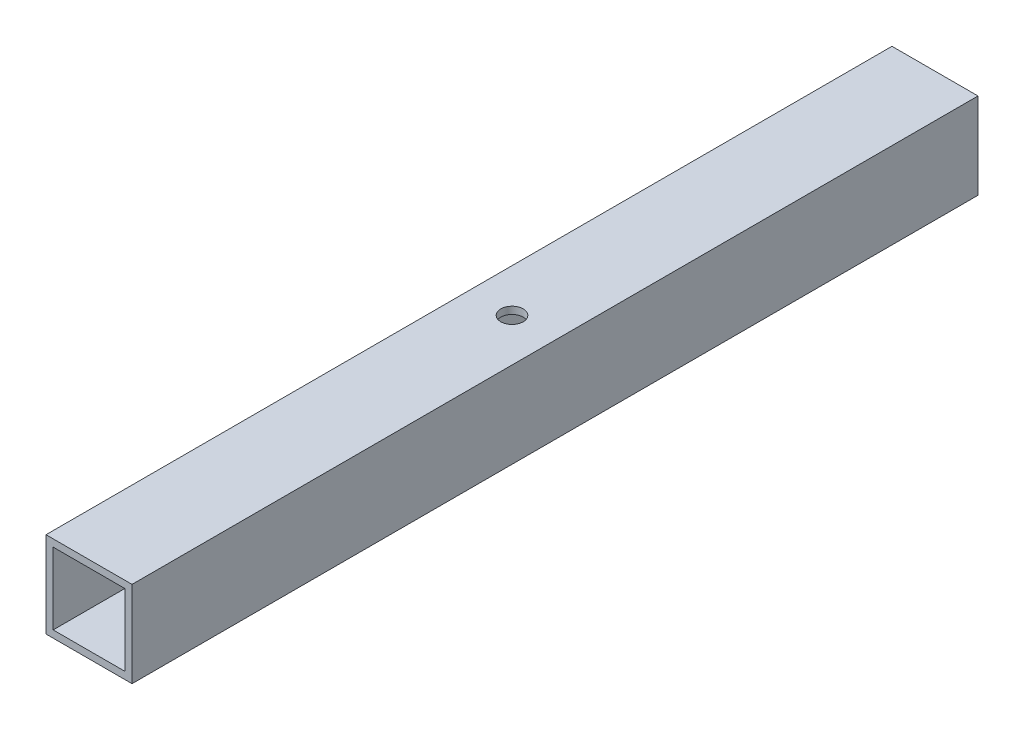
ISO-10303-21;
HEADER;
FILE_DESCRIPTION(('STEP AP214'),'2;1');
FILE_NAME('part.step','',(''),(''),'','','');
FILE_SCHEMA(('AUTOMOTIVE_DESIGN { 1 0 10303 214 1 1 1 1 }'));
ENDSEC;
DATA;
#1=APPLICATION_CONTEXT('core data for automotive mechanical design processes');
#2=APPLICATION_PROTOCOL_DEFINITION('international standard','automotive_design',2000,#1);
#3=PRODUCT_CONTEXT('',#1,'mechanical');
#4=PRODUCT('Part','Part','',(#3));
#5=PRODUCT_RELATED_PRODUCT_CATEGORY('part','',(#4));
#6=PRODUCT_DEFINITION_FORMATION('','',#4);
#7=PRODUCT_DEFINITION_CONTEXT('part definition',#1,'design');
#8=PRODUCT_DEFINITION('design','',#6,#7);
#9=PRODUCT_DEFINITION_SHAPE('','',#8);
#10=(LENGTH_UNIT() NAMED_UNIT(*) SI_UNIT(.MILLI.,.METRE.));
#11=(NAMED_UNIT(*) PLANE_ANGLE_UNIT() SI_UNIT($,.RADIAN.));
#12=(NAMED_UNIT(*) SI_UNIT($,.STERADIAN.) SOLID_ANGLE_UNIT());
#13=UNCERTAINTY_MEASURE_WITH_UNIT(LENGTH_MEASURE(1.E-05),#10,'distance_accuracy_value','');
#14=(GEOMETRIC_REPRESENTATION_CONTEXT(3) GLOBAL_UNCERTAINTY_ASSIGNED_CONTEXT((#13)) GLOBAL_UNIT_ASSIGNED_CONTEXT((#10,
#11,#12)) REPRESENTATION_CONTEXT('',''));
#15=CARTESIAN_POINT('',(0.,0.,0.));
#16=DIRECTION('',(0.,0.,1.));
#17=DIRECTION('',(1.,0.,0.));
#18=AXIS2_PLACEMENT_3D('',#15,#16,#17);
#19=CARTESIAN_POINT('',(0.,0.,374.65));
#20=DIRECTION('',(0.,0.,-1.));
#21=DIRECTION('',(-1.,0.,0.));
#22=AXIS2_PLACEMENT_3D('',#19,#20,#21);
#23=PLANE('',#22);
#24=DIRECTION('',(0.,1.,0.));
#25=VECTOR('',#24,1.);
#26=CARTESIAN_POINT('',(19.05,-19.05,374.65));
#27=LINE('',#26,#25);
#28=CARTESIAN_POINT('',(19.05,-19.05,374.65));
#29=VERTEX_POINT('',#28);
#30=CARTESIAN_POINT('',(19.05,19.05,374.65));
#31=VERTEX_POINT('',#30);
#32=EDGE_CURVE('E154',#29,#31,#27,.T.);
#33=ORIENTED_EDGE('',*,*,#32,.T.);
#34=DIRECTION('',(-1.,0.,0.));
#35=VECTOR('',#34,1.);
#36=CARTESIAN_POINT('',(-19.05,19.05,374.65));
#37=LINE('',#36,#35);
#38=CARTESIAN_POINT('',(-19.05,19.05,374.65));
#39=VERTEX_POINT('',#38);
#40=EDGE_CURVE('E158',#31,#39,#37,.T.);
#41=ORIENTED_EDGE('',*,*,#40,.T.);
#42=DIRECTION('',(0.,-1.,0.));
#43=VECTOR('',#42,1.);
#44=CARTESIAN_POINT('',(-19.05,-19.05,374.65));
#45=LINE('',#44,#43);
#46=CARTESIAN_POINT('',(-19.05,-19.05,374.65));
#47=VERTEX_POINT('',#46);
#48=EDGE_CURVE('E162',#39,#47,#45,.T.);
#49=ORIENTED_EDGE('',*,*,#48,.T.);
#50=DIRECTION('',(1.,0.,0.));
#51=VECTOR('',#50,1.);
#52=CARTESIAN_POINT('',(-19.05,-19.05,374.65));
#53=LINE('',#52,#51);
#54=EDGE_CURVE('E165',#47,#29,#53,.T.);
#55=ORIENTED_EDGE('',*,*,#54,.T.);
#56=EDGE_LOOP('',(#33,#41,#49,#55));
#57=FACE_BOUND('',#56,.T.);
#58=DIRECTION('',(0.,-1.,0.));
#59=VECTOR('',#58,1.);
#60=CARTESIAN_POINT('',(-15.875,-15.875,374.65));
#61=LINE('',#60,#59);
#62=CARTESIAN_POINT('',(-15.875,15.875,374.65));
#63=VERTEX_POINT('',#62);
#64=CARTESIAN_POINT('',(-15.875,-15.875,374.65));
#65=VERTEX_POINT('',#64);
#66=EDGE_CURVE('E103',#63,#65,#61,.T.);
#67=ORIENTED_EDGE('',*,*,#66,.F.);
#68=DIRECTION('',(-1.,0.,0.));
#69=VECTOR('',#68,1.);
#70=CARTESIAN_POINT('',(-15.875,15.875,374.65));
#71=LINE('',#70,#69);
#72=CARTESIAN_POINT('',(15.875,15.875,374.65));
#73=VERTEX_POINT('',#72);
#74=EDGE_CURVE('E130',#73,#63,#71,.T.);
#75=ORIENTED_EDGE('',*,*,#74,.F.);
#76=DIRECTION('',(0.,1.,0.));
#77=VECTOR('',#76,1.);
#78=CARTESIAN_POINT('',(15.875,-15.875,374.65));
#79=LINE('',#78,#77);
#80=CARTESIAN_POINT('',(15.875,-15.875,374.65));
#81=VERTEX_POINT('',#80);
#82=EDGE_CURVE('E125',#81,#73,#79,.T.);
#83=ORIENTED_EDGE('',*,*,#82,.F.);
#84=DIRECTION('',(1.,0.,0.));
#85=VECTOR('',#84,1.);
#86=CARTESIAN_POINT('',(-15.875,-15.875,374.65));
#87=LINE('',#86,#85);
#88=EDGE_CURVE('E112',#65,#81,#87,.T.);
#89=ORIENTED_EDGE('',*,*,#88,.F.);
#90=EDGE_LOOP('',(#67,#75,#83,#89));
#91=FACE_BOUND('',#90,.T.);
#92=ADVANCED_FACE('F36',(#57,#91),#23,.F.);
#93=CARTESIAN_POINT('',(0.,0.,0.));
#94=DIRECTION('',(0.,0.,-1.));
#95=DIRECTION('',(-1.,0.,0.));
#96=AXIS2_PLACEMENT_3D('',#93,#94,#95);
#97=PLANE('',#96);
#98=DIRECTION('',(0.,1.,0.));
#99=VECTOR('',#98,1.);
#100=CARTESIAN_POINT('',(19.05,-19.05,0.));
#101=LINE('',#100,#99);
#102=CARTESIAN_POINT('',(19.05,-19.05,0.));
#103=VERTEX_POINT('',#102);
#104=CARTESIAN_POINT('',(19.05,19.05,0.));
#105=VERTEX_POINT('',#104);
#106=EDGE_CURVE('E121',#103,#105,#101,.T.);
#107=ORIENTED_EDGE('',*,*,#106,.F.);
#108=DIRECTION('',(1.,0.,0.));
#109=VECTOR('',#108,1.);
#110=CARTESIAN_POINT('',(-19.05,-19.05,0.));
#111=LINE('',#110,#109);
#112=CARTESIAN_POINT('',(-19.05,-19.05,0.));
#113=VERTEX_POINT('',#112);
#114=EDGE_CURVE('E159',#113,#103,#111,.T.);
#115=ORIENTED_EDGE('',*,*,#114,.F.);
#116=DIRECTION('',(0.,-1.,0.));
#117=VECTOR('',#116,1.);
#118=CARTESIAN_POINT('',(-19.05,-19.05,0.));
#119=LINE('',#118,#117);
#120=CARTESIAN_POINT('',(-19.05,19.05,0.));
#121=VERTEX_POINT('',#120);
#122=EDGE_CURVE('E175',#121,#113,#119,.T.);
#123=ORIENTED_EDGE('',*,*,#122,.F.);
#124=DIRECTION('',(-1.,0.,0.));
#125=VECTOR('',#124,1.);
#126=CARTESIAN_POINT('',(-19.05,19.05,0.));
#127=LINE('',#126,#125);
#128=EDGE_CURVE('E172',#105,#121,#127,.T.);
#129=ORIENTED_EDGE('',*,*,#128,.F.);
#130=EDGE_LOOP('',(#107,#115,#123,#129));
#131=FACE_BOUND('',#130,.T.);
#132=DIRECTION('',(-1.,0.,0.));
#133=VECTOR('',#132,1.);
#134=CARTESIAN_POINT('',(-15.875,15.875,0.));
#135=LINE('',#134,#133);
#136=CARTESIAN_POINT('',(15.875,15.875,0.));
#137=VERTEX_POINT('',#136);
#138=CARTESIAN_POINT('',(-15.875,15.875,0.));
#139=VERTEX_POINT('',#138);
#140=EDGE_CURVE('E113',#137,#139,#135,.T.);
#141=ORIENTED_EDGE('',*,*,#140,.T.);
#142=DIRECTION('',(0.,-1.,0.));
#143=VECTOR('',#142,1.);
#144=CARTESIAN_POINT('',(-15.875,-15.875,0.));
#145=LINE('',#144,#143);
#146=CARTESIAN_POINT('',(-15.875,-15.875,0.));
#147=VERTEX_POINT('',#146);
#148=EDGE_CURVE('E61',#139,#147,#145,.T.);
#149=ORIENTED_EDGE('',*,*,#148,.T.);
#150=DIRECTION('',(1.,0.,0.));
#151=VECTOR('',#150,1.);
#152=CARTESIAN_POINT('',(-15.875,-15.875,0.));
#153=LINE('',#152,#151);
#154=CARTESIAN_POINT('',(15.875,-15.875,0.));
#155=VERTEX_POINT('',#154);
#156=EDGE_CURVE('E119',#147,#155,#153,.T.);
#157=ORIENTED_EDGE('',*,*,#156,.T.);
#158=DIRECTION('',(0.,1.,0.));
#159=VECTOR('',#158,1.);
#160=CARTESIAN_POINT('',(15.875,-15.875,0.));
#161=LINE('',#160,#159);
#162=EDGE_CURVE('E141',#155,#137,#161,.T.);
#163=ORIENTED_EDGE('',*,*,#162,.T.);
#164=EDGE_LOOP('',(#141,#149,#157,#163));
#165=FACE_BOUND('',#164,.T.);
#166=ADVANCED_FACE('F200',(#131,#165),#97,.T.);
#167=CARTESIAN_POINT('',(19.05,-19.05,374.65));
#168=DIRECTION('',(-1.,0.,0.));
#169=DIRECTION('',(0.,0.,1.));
#170=AXIS2_PLACEMENT_3D('',#167,#168,#169);
#171=PLANE('',#170);
#172=ORIENTED_EDGE('',*,*,#106,.T.);
#173=DIRECTION('',(0.,0.,-1.));
#174=VECTOR('',#173,1.);
#175=CARTESIAN_POINT('',(19.05,19.05,374.65));
#176=LINE('',#175,#174);
#177=EDGE_CURVE('E11',#31,#105,#176,.T.);
#178=ORIENTED_EDGE('',*,*,#177,.F.);
#179=ORIENTED_EDGE('',*,*,#32,.F.);
#180=DIRECTION('',(0.,0.,-1.));
#181=VECTOR('',#180,1.);
#182=CARTESIAN_POINT('',(19.05,-19.05,374.65));
#183=LINE('',#182,#181);
#184=EDGE_CURVE('E168',#29,#103,#183,.T.);
#185=ORIENTED_EDGE('',*,*,#184,.T.);
#186=EDGE_LOOP('',(#172,#178,#179,#185));
#187=FACE_BOUND('',#186,.T.);
#188=ADVANCED_FACE('F38',(#187),#171,.F.);
#189=CARTESIAN_POINT('',(-19.05,19.05,374.65));
#190=DIRECTION('',(0.,-1.,0.));
#191=DIRECTION('',(0.,0.,-1.));
#192=AXIS2_PLACEMENT_3D('',#189,#190,#191);
#193=PLANE('',#192);
#194=CARTESIAN_POINT('',(0.,19.05,187.325));
#195=DIRECTION('',(0.,1.,0.));
#196=DIRECTION('',(0.,0.,1.));
#197=AXIS2_PLACEMENT_3D('',#194,#195,#196);
#198=CIRCLE('',#197,4.96100099999999);
#199=CARTESIAN_POINT('',(0.,19.05,192.286001));
#200=VERTEX_POINT('',#199);
#201=EDGE_CURVE('E238',#200,#200,#198,.T.);
#202=ORIENTED_EDGE('',*,*,#201,.F.);
#203=EDGE_LOOP('',(#202));
#204=FACE_BOUND('',#203,.T.);
#205=ORIENTED_EDGE('',*,*,#128,.T.);
#206=DIRECTION('',(0.,0.,-1.));
#207=VECTOR('',#206,1.);
#208=CARTESIAN_POINT('',(-19.05,19.05,374.65));
#209=LINE('',#208,#207);
#210=EDGE_CURVE('E46',#39,#121,#209,.T.);
#211=ORIENTED_EDGE('',*,*,#210,.F.);
#212=ORIENTED_EDGE('',*,*,#40,.F.);
#213=ORIENTED_EDGE('',*,*,#177,.T.);
#214=EDGE_LOOP('',(#205,#211,#212,#213));
#215=FACE_BOUND('',#214,.T.);
#216=ADVANCED_FACE('F210',(#204,#215),#193,.F.);
#217=CARTESIAN_POINT('',(-19.05,-19.05,374.65));
#218=DIRECTION('',(1.,0.,0.));
#219=DIRECTION('',(0.,0.,-1.));
#220=AXIS2_PLACEMENT_3D('',#217,#218,#219);
#221=PLANE('',#220);
#222=ORIENTED_EDGE('',*,*,#122,.T.);
#223=DIRECTION('',(0.,0.,-1.));
#224=VECTOR('',#223,1.);
#225=CARTESIAN_POINT('',(-19.05,-19.05,374.65));
#226=LINE('',#225,#224);
#227=EDGE_CURVE('E183',#47,#113,#226,.T.);
#228=ORIENTED_EDGE('',*,*,#227,.F.);
#229=ORIENTED_EDGE('',*,*,#48,.F.);
#230=ORIENTED_EDGE('',*,*,#210,.T.);
#231=EDGE_LOOP('',(#222,#228,#229,#230));
#232=FACE_BOUND('',#231,.T.);
#233=ADVANCED_FACE('F194',(#232),#221,.F.);
#234=CARTESIAN_POINT('',(-19.05,-19.05,374.65));
#235=DIRECTION('',(0.,1.,0.));
#236=DIRECTION('',(0.,0.,1.));
#237=AXIS2_PLACEMENT_3D('',#234,#235,#236);
#238=PLANE('',#237);
#239=CARTESIAN_POINT('',(0.,-19.05,187.325));
#240=DIRECTION('',(0.,1.,0.));
#241=DIRECTION('',(0.,0.,1.));
#242=AXIS2_PLACEMENT_3D('',#239,#240,#241);
#243=CIRCLE('',#242,4.96100099999999);
#244=CARTESIAN_POINT('',(0.,-19.05,192.286001));
#245=VERTEX_POINT('',#244);
#246=EDGE_CURVE('E235',#245,#245,#243,.T.);
#247=ORIENTED_EDGE('',*,*,#246,.T.);
#248=EDGE_LOOP('',(#247));
#249=FACE_BOUND('',#248,.T.);
#250=ORIENTED_EDGE('',*,*,#114,.T.);
#251=ORIENTED_EDGE('',*,*,#184,.F.);
#252=ORIENTED_EDGE('',*,*,#54,.F.);
#253=ORIENTED_EDGE('',*,*,#227,.T.);
#254=EDGE_LOOP('',(#250,#251,#252,#253));
#255=FACE_BOUND('',#254,.T.);
#256=ADVANCED_FACE('F204',(#249,#255),#238,.F.);
#257=CARTESIAN_POINT('',(-15.875,-15.875,374.65));
#258=DIRECTION('',(1.,0.,0.));
#259=DIRECTION('',(0.,0.,-1.));
#260=AXIS2_PLACEMENT_3D('',#257,#258,#259);
#261=PLANE('',#260);
#262=ORIENTED_EDGE('',*,*,#148,.F.);
#263=DIRECTION('',(0.,0.,-1.));
#264=VECTOR('',#263,1.);
#265=CARTESIAN_POINT('',(-15.875,15.875,374.65));
#266=LINE('',#265,#264);
#267=EDGE_CURVE('E107',#63,#139,#266,.T.);
#268=ORIENTED_EDGE('',*,*,#267,.F.);
#269=ORIENTED_EDGE('',*,*,#66,.T.);
#270=DIRECTION('',(0.,0.,-1.));
#271=VECTOR('',#270,1.);
#272=CARTESIAN_POINT('',(-15.875,-15.875,374.65));
#273=LINE('',#272,#271);
#274=EDGE_CURVE('E106',#65,#147,#273,.T.);
#275=ORIENTED_EDGE('',*,*,#274,.T.);
#276=EDGE_LOOP('',(#262,#268,#269,#275));
#277=FACE_BOUND('',#276,.T.);
#278=ADVANCED_FACE('F105',(#277),#261,.T.);
#279=CARTESIAN_POINT('',(-15.875,-15.875,374.65));
#280=DIRECTION('',(0.,1.,0.));
#281=DIRECTION('',(0.,0.,1.));
#282=AXIS2_PLACEMENT_3D('',#279,#280,#281);
#283=PLANE('',#282);
#284=CARTESIAN_POINT('',(0.,-15.875,187.325));
#285=DIRECTION('',(0.,1.,0.));
#286=DIRECTION('',(0.,0.,1.));
#287=AXIS2_PLACEMENT_3D('',#284,#285,#286);
#288=CIRCLE('',#287,4.96100099999999);
#289=CARTESIAN_POINT('',(0.,-15.875,192.286001));
#290=VERTEX_POINT('',#289);
#291=EDGE_CURVE('E40',#290,#290,#288,.T.);
#292=ORIENTED_EDGE('',*,*,#291,.F.);
#293=EDGE_LOOP('',(#292));
#294=FACE_BOUND('',#293,.T.);
#295=ORIENTED_EDGE('',*,*,#156,.F.);
#296=ORIENTED_EDGE('',*,*,#274,.F.);
#297=ORIENTED_EDGE('',*,*,#88,.T.);
#298=DIRECTION('',(0.,0.,-1.));
#299=VECTOR('',#298,1.);
#300=CARTESIAN_POINT('',(15.875,-15.875,374.65));
#301=LINE('',#300,#299);
#302=EDGE_CURVE('E122',#81,#155,#301,.T.);
#303=ORIENTED_EDGE('',*,*,#302,.T.);
#304=EDGE_LOOP('',(#295,#296,#297,#303));
#305=FACE_BOUND('',#304,.T.);
#306=ADVANCED_FACE('F116',(#294,#305),#283,.T.);
#307=CARTESIAN_POINT('',(15.875,-15.875,374.65));
#308=DIRECTION('',(-1.,0.,0.));
#309=DIRECTION('',(0.,-1.,0.));
#310=AXIS2_PLACEMENT_3D('',#307,#308,#309);
#311=PLANE('',#310);
#312=ORIENTED_EDGE('',*,*,#162,.F.);
#313=ORIENTED_EDGE('',*,*,#302,.F.);
#314=ORIENTED_EDGE('',*,*,#82,.T.);
#315=DIRECTION('',(0.,0.,-1.));
#316=VECTOR('',#315,1.);
#317=CARTESIAN_POINT('',(15.875,15.875,374.65));
#318=LINE('',#317,#316);
#319=EDGE_CURVE('E53',#73,#137,#318,.T.);
#320=ORIENTED_EDGE('',*,*,#319,.T.);
#321=EDGE_LOOP('',(#312,#313,#314,#320));
#322=FACE_BOUND('',#321,.T.);
#323=ADVANCED_FACE('F257',(#322),#311,.T.);
#324=CARTESIAN_POINT('',(-15.875,15.875,374.65));
#325=DIRECTION('',(0.,-1.,0.));
#326=DIRECTION('',(1.,0.,0.));
#327=AXIS2_PLACEMENT_3D('',#324,#325,#326);
#328=PLANE('',#327);
#329=CARTESIAN_POINT('',(0.,15.875,187.325));
#330=DIRECTION('',(0.,-1.,0.));
#331=DIRECTION('',(1.,0.,0.));
#332=AXIS2_PLACEMENT_3D('',#329,#330,#331);
#333=CIRCLE('',#332,4.96100099999999);
#334=CARTESIAN_POINT('',(4.96100099999999,15.875,187.325));
#335=VERTEX_POINT('',#334);
#336=EDGE_CURVE('E138',#335,#335,#333,.T.);
#337=ORIENTED_EDGE('',*,*,#336,.F.);
#338=EDGE_LOOP('',(#337));
#339=FACE_BOUND('',#338,.T.);
#340=ORIENTED_EDGE('',*,*,#140,.F.);
#341=ORIENTED_EDGE('',*,*,#319,.F.);
#342=ORIENTED_EDGE('',*,*,#74,.T.);
#343=ORIENTED_EDGE('',*,*,#267,.T.);
#344=EDGE_LOOP('',(#340,#341,#342,#343));
#345=FACE_BOUND('',#344,.T.);
#346=ADVANCED_FACE('F254',(#339,#345),#328,.T.);
#347=CARTESIAN_POINT('',(0.,19.05,187.325));
#348=DIRECTION('',(0.,1.,0.));
#349=DIRECTION('',(0.,0.,1.));
#350=AXIS2_PLACEMENT_3D('',#347,#348,#349);
#351=CYLINDRICAL_SURFACE('',#350,4.96100099999999);
#352=ORIENTED_EDGE('',*,*,#291,.T.);
#353=EDGE_LOOP('',(#352));
#354=FACE_BOUND('',#353,.T.);
#355=ORIENTED_EDGE('',*,*,#246,.F.);
#356=EDGE_LOOP('',(#355));
#357=FACE_BOUND('',#356,.T.);
#358=ADVANCED_FACE('F256',(#354,#357),#351,.F.);
#359=ORIENTED_EDGE('',*,*,#336,.T.);
#360=EDGE_LOOP('',(#359));
#361=FACE_BOUND('',#360,.T.);
#362=ORIENTED_EDGE('',*,*,#201,.T.);
#363=EDGE_LOOP('',(#362));
#364=FACE_BOUND('',#363,.T.);
#365=ADVANCED_FACE('F251',(#361,#364),#351,.F.);
#366=CLOSED_SHELL('',(#92,#166,#188,#216,#233,#256,#278,#306,#323,#346,#358,#365));
#367=MANIFOLD_SOLID_BREP('B2',#366);
#368=ADVANCED_BREP_SHAPE_REPRESENTATION('',(#18,#367),#14);
#369=SHAPE_DEFINITION_REPRESENTATION(#9,#368);
ENDSEC;
END-ISO-10303-21;
